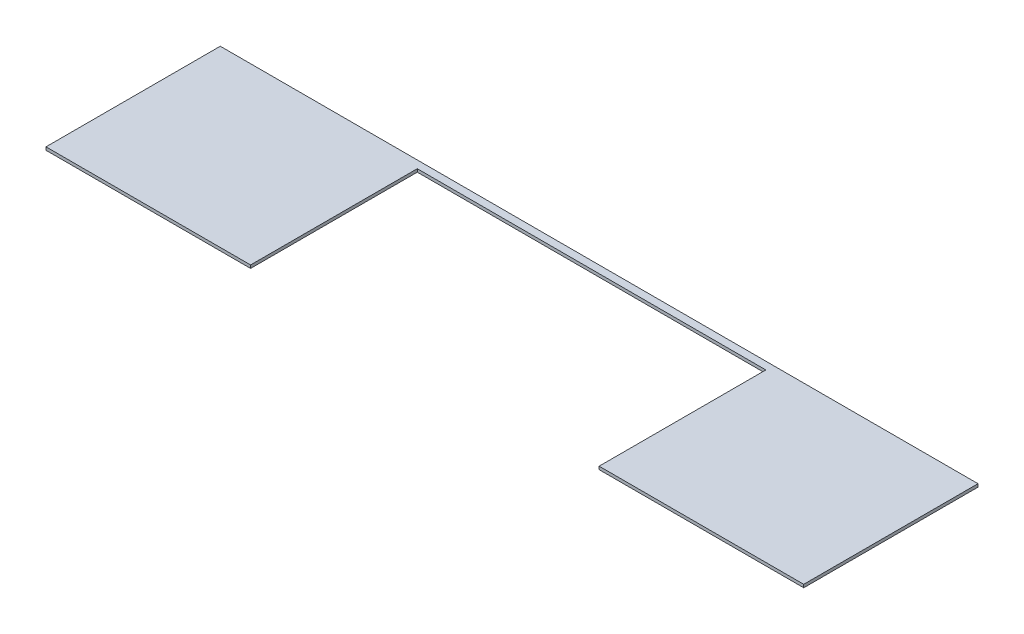
ISO-10303-21;
HEADER;
FILE_DESCRIPTION(('STEP AP214'),'2;1');
FILE_NAME('part.step','',(''),(''),'','','');
FILE_SCHEMA(('AUTOMOTIVE_DESIGN { 1 0 10303 214 1 1 1 1 }'));
ENDSEC;
DATA;
#1=APPLICATION_CONTEXT('core data for automotive mechanical design processes');
#2=APPLICATION_PROTOCOL_DEFINITION('international standard','automotive_design',2000,#1);
#3=PRODUCT_CONTEXT('',#1,'mechanical');
#4=PRODUCT('Part','Part','',(#3));
#5=PRODUCT_RELATED_PRODUCT_CATEGORY('part','',(#4));
#6=PRODUCT_DEFINITION_FORMATION('','',#4);
#7=PRODUCT_DEFINITION_CONTEXT('part definition',#1,'design');
#8=PRODUCT_DEFINITION('design','',#6,#7);
#9=PRODUCT_DEFINITION_SHAPE('','',#8);
#10=(LENGTH_UNIT() NAMED_UNIT(*) SI_UNIT(.MILLI.,.METRE.));
#11=(NAMED_UNIT(*) PLANE_ANGLE_UNIT() SI_UNIT($,.RADIAN.));
#12=(NAMED_UNIT(*) SI_UNIT($,.STERADIAN.) SOLID_ANGLE_UNIT());
#13=UNCERTAINTY_MEASURE_WITH_UNIT(LENGTH_MEASURE(1.E-05),#10,'distance_accuracy_value','');
#14=(GEOMETRIC_REPRESENTATION_CONTEXT(3) GLOBAL_UNCERTAINTY_ASSIGNED_CONTEXT((#13)) GLOBAL_UNIT_ASSIGNED_CONTEXT((#10,
#11,#12)) REPRESENTATION_CONTEXT('',''));
#15=CARTESIAN_POINT('',(0.,0.,0.));
#16=DIRECTION('',(0.,0.,1.));
#17=DIRECTION('',(1.,0.,0.));
#18=AXIS2_PLACEMENT_3D('',#15,#16,#17);
#19=CARTESIAN_POINT('',(-176.512287334594,2.,-4.09262759924385));
#20=DIRECTION('',(0.,0.,-1.));
#21=DIRECTION('',(-1.,0.,0.));
#22=AXIS2_PLACEMENT_3D('',#19,#20,#21);
#23=PLANE('',#22);
#24=DIRECTION('',(1.,0.,0.));
#25=VECTOR('',#24,1.);
#26=CARTESIAN_POINT('',(-176.512287334594,0.,-4.09262759924385));
#27=LINE('',#26,#25);
#28=CARTESIAN_POINT('',(-176.512287334594,0.,-4.09262759924385));
#29=VERTEX_POINT('',#28);
#30=CARTESIAN_POINT('',(-41.5122873345936,0.,-4.09262759924385));
#31=VERTEX_POINT('',#30);
#32=EDGE_CURVE('E149',#29,#31,#27,.T.);
#33=ORIENTED_EDGE('',*,*,#32,.T.);
#34=DIRECTION('',(0.,1.,0.));
#35=VECTOR('',#34,1.);
#36=CARTESIAN_POINT('',(-41.5122873345936,-8.,-4.09262759924385));
#37=LINE('',#36,#35);
#38=CARTESIAN_POINT('',(-41.5122873345936,2.,-4.09262759924385));
#39=VERTEX_POINT('',#38);
#40=EDGE_CURVE('E148',#31,#39,#37,.T.);
#41=ORIENTED_EDGE('',*,*,#40,.T.);
#42=DIRECTION('',(1.,0.,0.));
#43=VECTOR('',#42,1.);
#44=CARTESIAN_POINT('',(-176.512287334594,2.,-4.09262759924385));
#45=LINE('',#44,#43);
#46=CARTESIAN_POINT('',(-176.512287334594,2.,-4.09262759924385));
#47=VERTEX_POINT('',#46);
#48=EDGE_CURVE('E92',#47,#39,#45,.T.);
#49=ORIENTED_EDGE('',*,*,#48,.F.);
#50=DIRECTION('',(0.,-1.,0.));
#51=VECTOR('',#50,1.);
#52=CARTESIAN_POINT('',(-176.512287334594,2.,-4.09262759924385));
#53=LINE('',#52,#51);
#54=EDGE_CURVE('E159',#47,#29,#53,.T.);
#55=ORIENTED_EDGE('',*,*,#54,.T.);
#56=EDGE_LOOP('',(#33,#41,#49,#55));
#57=FACE_BOUND('',#56,.T.);
#58=ADVANCED_FACE('F39',(#57),#23,.F.);
#59=CARTESIAN_POINT('',(-176.512287334594,2.,-119.092627599244));
#60=DIRECTION('',(1.,0.,0.));
#61=DIRECTION('',(0.,0.,-1.));
#62=AXIS2_PLACEMENT_3D('',#59,#60,#61);
#63=PLANE('',#62);
#64=DIRECTION('',(0.,0.,1.));
#65=VECTOR('',#64,1.);
#66=CARTESIAN_POINT('',(-176.512287334594,0.,-119.092627599244));
#67=LINE('',#66,#65);
#68=CARTESIAN_POINT('',(-176.512287334594,0.,-119.092627599244));
#69=VERTEX_POINT('',#68);
#70=EDGE_CURVE('E144',#69,#29,#67,.T.);
#71=ORIENTED_EDGE('',*,*,#70,.T.);
#72=ORIENTED_EDGE('',*,*,#54,.F.);
#73=DIRECTION('',(0.,0.,1.));
#74=VECTOR('',#73,1.);
#75=CARTESIAN_POINT('',(-176.512287334594,2.,-119.092627599244));
#76=LINE('',#75,#74);
#77=CARTESIAN_POINT('',(-176.512287334594,2.,-119.092627599244));
#78=VERTEX_POINT('',#77);
#79=EDGE_CURVE('E136',#78,#47,#76,.T.);
#80=ORIENTED_EDGE('',*,*,#79,.F.);
#81=DIRECTION('',(0.,-1.,0.));
#82=VECTOR('',#81,1.);
#83=CARTESIAN_POINT('',(-176.512287334594,2.,-119.092627599244));
#84=LINE('',#83,#82);
#85=EDGE_CURVE('E143',#78,#69,#84,.T.);
#86=ORIENTED_EDGE('',*,*,#85,.T.);
#87=EDGE_LOOP('',(#71,#72,#80,#86));
#88=FACE_BOUND('',#87,.T.);
#89=ADVANCED_FACE('F41',(#88),#63,.F.);
#90=CARTESIAN_POINT('',(188.487712665406,2.,-4.09262759924385));
#91=VERTEX_POINT('',#90);
#92=CARTESIAN_POINT('',(323.487712665406,2.,-4.09262759924385));
#93=VERTEX_POINT('',#92);
#94=EDGE_CURVE('E127',#91,#93,#45,.T.);
#95=ORIENTED_EDGE('',*,*,#94,.F.);
#96=DIRECTION('',(0.,1.,0.));
#97=VECTOR('',#96,1.);
#98=CARTESIAN_POINT('',(188.487712665406,-8.,-4.09262759924385));
#99=LINE('',#98,#97);
#100=CARTESIAN_POINT('',(188.487712665406,0.,-4.09262759924385));
#101=VERTEX_POINT('',#100);
#102=EDGE_CURVE('E113',#101,#91,#99,.T.);
#103=ORIENTED_EDGE('',*,*,#102,.F.);
#104=CARTESIAN_POINT('',(323.487712665406,0.,-4.09262759924385));
#105=VERTEX_POINT('',#104);
#106=EDGE_CURVE('E147',#101,#105,#27,.T.);
#107=ORIENTED_EDGE('',*,*,#106,.T.);
#108=DIRECTION('',(0.,-1.,0.));
#109=VECTOR('',#108,1.);
#110=CARTESIAN_POINT('',(323.487712665406,2.,-4.09262759924385));
#111=LINE('',#110,#109);
#112=EDGE_CURVE('E134',#93,#105,#111,.T.);
#113=ORIENTED_EDGE('',*,*,#112,.F.);
#114=EDGE_LOOP('',(#95,#103,#107,#113));
#115=FACE_BOUND('',#114,.T.);
#116=ADVANCED_FACE('F132',(#115),#23,.F.);
#117=CARTESIAN_POINT('',(323.487712665406,2.,-119.092627599244));
#118=DIRECTION('',(-1.,0.,0.));
#119=DIRECTION('',(0.,0.,1.));
#120=AXIS2_PLACEMENT_3D('',#117,#118,#119);
#121=PLANE('',#120);
#122=DIRECTION('',(0.,0.,-1.));
#123=VECTOR('',#122,1.);
#124=CARTESIAN_POINT('',(323.487712665406,0.,-119.092627599244));
#125=LINE('',#124,#123);
#126=CARTESIAN_POINT('',(323.487712665406,0.,-119.092627599244));
#127=VERTEX_POINT('',#126);
#128=EDGE_CURVE('E152',#105,#127,#125,.T.);
#129=ORIENTED_EDGE('',*,*,#128,.T.);
#130=DIRECTION('',(0.,-1.,0.));
#131=VECTOR('',#130,1.);
#132=CARTESIAN_POINT('',(323.487712665406,2.,-119.092627599244));
#133=LINE('',#132,#131);
#134=CARTESIAN_POINT('',(323.487712665406,2.,-119.092627599244));
#135=VERTEX_POINT('',#134);
#136=EDGE_CURVE('E156',#135,#127,#133,.T.);
#137=ORIENTED_EDGE('',*,*,#136,.F.);
#138=DIRECTION('',(0.,0.,-1.));
#139=VECTOR('',#138,1.);
#140=CARTESIAN_POINT('',(323.487712665406,2.,-119.092627599244));
#141=LINE('',#140,#139);
#142=EDGE_CURVE('E138',#93,#135,#141,.T.);
#143=ORIENTED_EDGE('',*,*,#142,.F.);
#144=ORIENTED_EDGE('',*,*,#112,.T.);
#145=EDGE_LOOP('',(#129,#137,#143,#144));
#146=FACE_BOUND('',#145,.T.);
#147=ADVANCED_FACE('F182',(#146),#121,.F.);
#148=CARTESIAN_POINT('',(-176.512287334594,2.,-119.092627599244));
#149=DIRECTION('',(0.,0.,1.));
#150=DIRECTION('',(1.,0.,0.));
#151=AXIS2_PLACEMENT_3D('',#148,#149,#150);
#152=PLANE('',#151);
#153=DIRECTION('',(-1.,0.,0.));
#154=VECTOR('',#153,1.);
#155=CARTESIAN_POINT('',(-176.512287334594,0.,-119.092627599244));
#156=LINE('',#155,#154);
#157=EDGE_CURVE('E84',#127,#69,#156,.T.);
#158=ORIENTED_EDGE('',*,*,#157,.T.);
#159=ORIENTED_EDGE('',*,*,#85,.F.);
#160=DIRECTION('',(-1.,0.,0.));
#161=VECTOR('',#160,1.);
#162=CARTESIAN_POINT('',(-176.512287334594,2.,-119.092627599244));
#163=LINE('',#162,#161);
#164=EDGE_CURVE('E63',#135,#78,#163,.T.);
#165=ORIENTED_EDGE('',*,*,#164,.F.);
#166=ORIENTED_EDGE('',*,*,#136,.T.);
#167=EDGE_LOOP('',(#158,#159,#165,#166));
#168=FACE_BOUND('',#167,.T.);
#169=ADVANCED_FACE('F183',(#168),#152,.F.);
#170=CARTESIAN_POINT('',(0.,2.,0.));
#171=DIRECTION('',(0.,1.,0.));
#172=DIRECTION('',(0.,0.,1.));
#173=AXIS2_PLACEMENT_3D('',#170,#171,#172);
#174=PLANE('',#173);
#175=DIRECTION('',(0.,0.,1.));
#176=VECTOR('',#175,1.);
#177=CARTESIAN_POINT('',(-41.5122873345936,2.,-4.09262759924385));
#178=LINE('',#177,#176);
#179=CARTESIAN_POINT('',(-41.5122873345936,2.,-114.092627599244));
#180=VERTEX_POINT('',#179);
#181=EDGE_CURVE('E123',#180,#39,#178,.T.);
#182=ORIENTED_EDGE('',*,*,#181,.F.);
#183=DIRECTION('',(-1.,0.,0.));
#184=VECTOR('',#183,1.);
#185=CARTESIAN_POINT('',(-41.5122873345936,2.,-114.092627599244));
#186=LINE('',#185,#184);
#187=CARTESIAN_POINT('',(188.487712665406,2.,-114.092627599244));
#188=VERTEX_POINT('',#187);
#189=EDGE_CURVE('E130',#188,#180,#186,.T.);
#190=ORIENTED_EDGE('',*,*,#189,.F.);
#191=DIRECTION('',(0.,0.,-1.));
#192=VECTOR('',#191,1.);
#193=CARTESIAN_POINT('',(188.487712665406,2.,-114.092627599244));
#194=LINE('',#193,#192);
#195=EDGE_CURVE('E116',#91,#188,#194,.T.);
#196=ORIENTED_EDGE('',*,*,#195,.F.);
#197=ORIENTED_EDGE('',*,*,#94,.T.);
#198=ORIENTED_EDGE('',*,*,#142,.T.);
#199=ORIENTED_EDGE('',*,*,#164,.T.);
#200=ORIENTED_EDGE('',*,*,#79,.T.);
#201=ORIENTED_EDGE('',*,*,#48,.T.);
#202=EDGE_LOOP('',(#182,#190,#196,#197,#198,#199,#200,#201));
#203=FACE_BOUND('',#202,.T.);
#204=ADVANCED_FACE('F126',(#203),#174,.T.);
#205=CARTESIAN_POINT('',(0.,0.,0.));
#206=DIRECTION('',(0.,1.,0.));
#207=DIRECTION('',(0.,0.,1.));
#208=AXIS2_PLACEMENT_3D('',#205,#206,#207);
#209=PLANE('',#208);
#210=DIRECTION('',(-1.,0.,0.));
#211=VECTOR('',#210,1.);
#212=CARTESIAN_POINT('',(0.,0.,-114.092627599244));
#213=LINE('',#212,#211);
#214=CARTESIAN_POINT('',(188.487712665406,0.,-114.092627599244));
#215=VERTEX_POINT('',#214);
#216=CARTESIAN_POINT('',(-41.5122873345936,0.,-114.092627599244));
#217=VERTEX_POINT('',#216);
#218=EDGE_CURVE('E47',#215,#217,#213,.T.);
#219=ORIENTED_EDGE('',*,*,#218,.T.);
#220=DIRECTION('',(0.,0.,1.));
#221=VECTOR('',#220,1.);
#222=CARTESIAN_POINT('',(-41.5122873345936,0.,0.));
#223=LINE('',#222,#221);
#224=EDGE_CURVE('E11',#217,#31,#223,.T.);
#225=ORIENTED_EDGE('',*,*,#224,.T.);
#226=ORIENTED_EDGE('',*,*,#32,.F.);
#227=ORIENTED_EDGE('',*,*,#70,.F.);
#228=ORIENTED_EDGE('',*,*,#157,.F.);
#229=ORIENTED_EDGE('',*,*,#128,.F.);
#230=ORIENTED_EDGE('',*,*,#106,.F.);
#231=DIRECTION('',(0.,0.,-1.));
#232=VECTOR('',#231,1.);
#233=CARTESIAN_POINT('',(188.487712665406,0.,0.));
#234=LINE('',#233,#232);
#235=EDGE_CURVE('E119',#101,#215,#234,.T.);
#236=ORIENTED_EDGE('',*,*,#235,.T.);
#237=EDGE_LOOP('',(#219,#225,#226,#227,#228,#229,#230,#236));
#238=FACE_BOUND('',#237,.T.);
#239=ADVANCED_FACE('F163',(#238),#209,.F.);
#240=CARTESIAN_POINT('',(-41.5122873345936,-8.,-4.09262759924385));
#241=DIRECTION('',(-1.,0.,0.));
#242=DIRECTION('',(0.,0.,1.));
#243=AXIS2_PLACEMENT_3D('',#240,#241,#242);
#244=PLANE('',#243);
#245=DIRECTION('',(0.,1.,0.));
#246=VECTOR('',#245,1.);
#247=CARTESIAN_POINT('',(-41.5122873345936,-8.,-114.092627599244));
#248=LINE('',#247,#246);
#249=EDGE_CURVE('E167',#217,#180,#248,.T.);
#250=ORIENTED_EDGE('',*,*,#249,.T.);
#251=ORIENTED_EDGE('',*,*,#181,.T.);
#252=ORIENTED_EDGE('',*,*,#40,.F.);
#253=ORIENTED_EDGE('',*,*,#224,.F.);
#254=EDGE_LOOP('',(#250,#251,#252,#253));
#255=FACE_BOUND('',#254,.T.);
#256=ADVANCED_FACE('F174',(#255),#244,.F.);
#257=CARTESIAN_POINT('',(-41.5122873345936,-8.,-114.092627599244));
#258=DIRECTION('',(0.,0.,-1.));
#259=DIRECTION('',(-1.,0.,0.));
#260=AXIS2_PLACEMENT_3D('',#257,#258,#259);
#261=PLANE('',#260);
#262=DIRECTION('',(0.,1.,0.));
#263=VECTOR('',#262,1.);
#264=CARTESIAN_POINT('',(188.487712665406,-8.,-114.092627599244));
#265=LINE('',#264,#263);
#266=EDGE_CURVE('E54',#215,#188,#265,.T.);
#267=ORIENTED_EDGE('',*,*,#266,.T.);
#268=ORIENTED_EDGE('',*,*,#189,.T.);
#269=ORIENTED_EDGE('',*,*,#249,.F.);
#270=ORIENTED_EDGE('',*,*,#218,.F.);
#271=EDGE_LOOP('',(#267,#268,#269,#270));
#272=FACE_BOUND('',#271,.T.);
#273=ADVANCED_FACE('F166',(#272),#261,.F.);
#274=CARTESIAN_POINT('',(188.487712665406,-8.,-114.092627599244));
#275=DIRECTION('',(1.,0.,0.));
#276=DIRECTION('',(0.,0.,-1.));
#277=AXIS2_PLACEMENT_3D('',#274,#275,#276);
#278=PLANE('',#277);
#279=ORIENTED_EDGE('',*,*,#102,.T.);
#280=ORIENTED_EDGE('',*,*,#195,.T.);
#281=ORIENTED_EDGE('',*,*,#266,.F.);
#282=ORIENTED_EDGE('',*,*,#235,.F.);
#283=EDGE_LOOP('',(#279,#280,#281,#282));
#284=FACE_BOUND('',#283,.T.);
#285=ADVANCED_FACE('F115',(#284),#278,.F.);
#286=CLOSED_SHELL('',(#58,#89,#116,#147,#169,#204,#239,#256,#273,#285));
#287=MANIFOLD_SOLID_BREP('B2',#286);
#288=ADVANCED_BREP_SHAPE_REPRESENTATION('',(#18,#287),#14);
#289=SHAPE_DEFINITION_REPRESENTATION(#9,#288);
ENDSEC;
END-ISO-10303-21;
